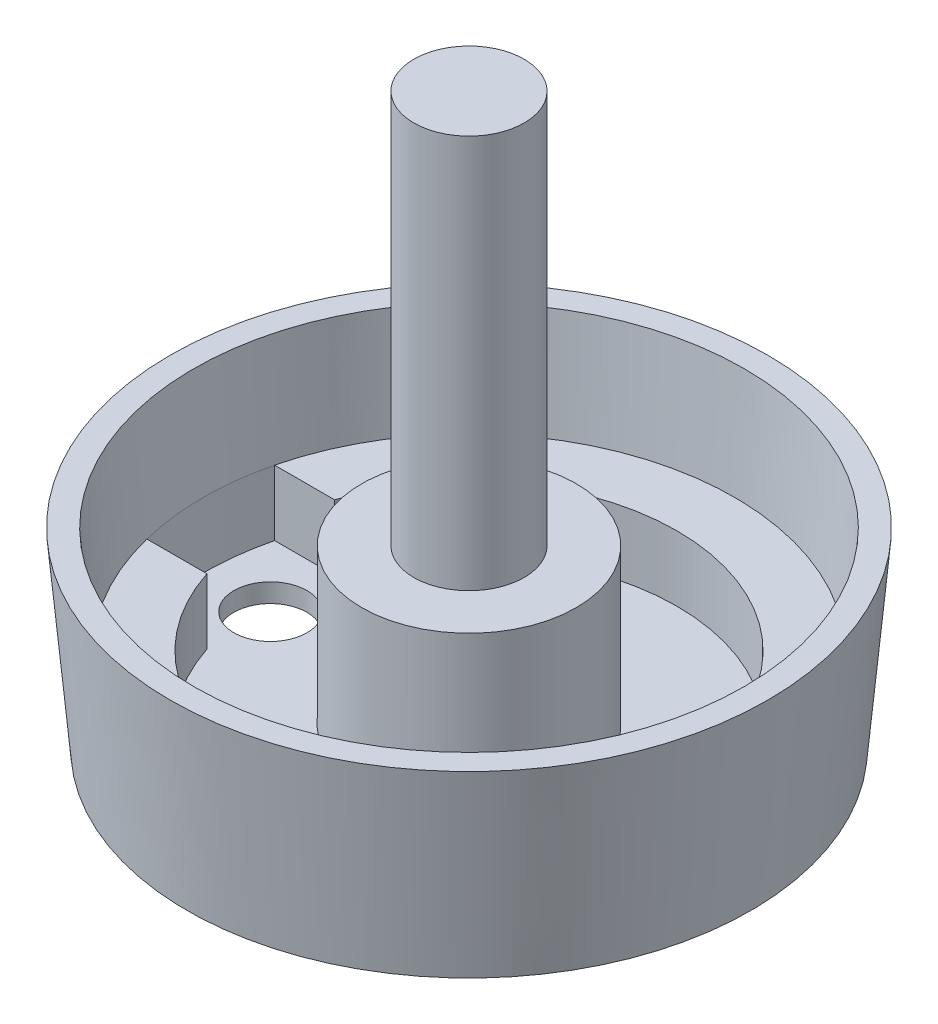
ISO-10303-21;
HEADER;
FILE_DESCRIPTION(('STEP AP214'),'2;1');
FILE_NAME('part.step','',(''),(''),'','','');
FILE_SCHEMA(('AUTOMOTIVE_DESIGN { 1 0 10303 214 1 1 1 1 }'));
ENDSEC;
DATA;
#1=APPLICATION_CONTEXT('core data for automotive mechanical design processes');
#2=APPLICATION_PROTOCOL_DEFINITION('international standard','automotive_design',2000,#1);
#3=PRODUCT_CONTEXT('',#1,'mechanical');
#4=PRODUCT('Part','Part','',(#3));
#5=PRODUCT_RELATED_PRODUCT_CATEGORY('part','',(#4));
#6=PRODUCT_DEFINITION_FORMATION('','',#4);
#7=PRODUCT_DEFINITION_CONTEXT('part definition',#1,'design');
#8=PRODUCT_DEFINITION('design','',#6,#7);
#9=PRODUCT_DEFINITION_SHAPE('','',#8);
#10=(LENGTH_UNIT() NAMED_UNIT(*) SI_UNIT(.MILLI.,.METRE.));
#11=(NAMED_UNIT(*) PLANE_ANGLE_UNIT() SI_UNIT($,.RADIAN.));
#12=(NAMED_UNIT(*) SI_UNIT($,.STERADIAN.) SOLID_ANGLE_UNIT());
#13=UNCERTAINTY_MEASURE_WITH_UNIT(LENGTH_MEASURE(1.E-05),#10,'distance_accuracy_value','');
#14=(GEOMETRIC_REPRESENTATION_CONTEXT(3) GLOBAL_UNCERTAINTY_ASSIGNED_CONTEXT((#13)) GLOBAL_UNIT_ASSIGNED_CONTEXT((#10,
#11,#12)) REPRESENTATION_CONTEXT('',''));
#15=CARTESIAN_POINT('',(0.,0.,0.));
#16=DIRECTION('',(0.,0.,1.));
#17=DIRECTION('',(1.,0.,0.));
#18=AXIS2_PLACEMENT_3D('',#15,#16,#17);
#19=CARTESIAN_POINT('',(16.891,31.242,0.));
#20=DIRECTION('',(0.,-1.,0.));
#21=DIRECTION('',(0.,0.,-1.));
#22=AXIS2_PLACEMENT_3D('',#19,#20,#21);
#23=CYLINDRICAL_SURFACE('',#22,3.175);
#24=CARTESIAN_POINT('',(16.891,0.,0.));
#25=DIRECTION('',(0.,-1.,0.));
#26=DIRECTION('',(0.,0.,-1.));
#27=AXIS2_PLACEMENT_3D('',#24,#25,#26);
#28=CIRCLE('',#27,3.175);
#29=CARTESIAN_POINT('',(16.891,0.,-3.175));
#30=VERTEX_POINT('',#29);
#31=EDGE_CURVE('E329',#30,#30,#28,.T.);
#32=CARTESIAN_POINT('',(16.891,1.56209999999999,0.));
#33=DIRECTION('',(0.,1.,0.));
#34=DIRECTION('',(0.,0.,1.));
#35=AXIS2_PLACEMENT_3D('',#32,#33,#34);
#36=CIRCLE('',#35,3.175);
#37=CARTESIAN_POINT('',(16.891,1.56209999999999,-3.175));
#38=VERTEX_POINT('',#37);
#39=EDGE_CURVE('E49',#38,#38,#36,.F.);
#40=CARTESIAN_POINT('',(16.891,0.,-3.175));
#41=CARTESIAN_POINT('',(16.891,0.0162718750000036,-3.175));
#42=CARTESIAN_POINT('',(16.891,0.0325437500000037,-3.175));
#43=CARTESIAN_POINT('',(16.891,0.0650875000000039,-3.175));
#44=CARTESIAN_POINT('',(16.891,0.081359375000004,-3.175));
#45=CARTESIAN_POINT('',(16.891,0.113903125000003,-3.175));
#46=CARTESIAN_POINT('',(16.891,0.130175000000002,-3.175));
#47=CARTESIAN_POINT('',(16.891,0.162718750000001,-3.175));
#48=CARTESIAN_POINT('',(16.891,0.178990625000001,-3.175));
#49=CARTESIAN_POINT('',(16.891,0.211534375000001,-3.175));
#50=CARTESIAN_POINT('',(16.891,0.227806250000002,-3.175));
#51=CARTESIAN_POINT('',(16.891,0.260350000000002,-3.175));
#52=CARTESIAN_POINT('',(16.891,0.276621875000002,-3.175));
#53=CARTESIAN_POINT('',(16.891,0.309165625000002,-3.175));
#54=CARTESIAN_POINT('',(16.891,0.325437500000002,-3.175));
#55=CARTESIAN_POINT('',(16.891,0.357981250000001,-3.175));
#56=CARTESIAN_POINT('',(16.891,0.374253125,-3.175));
#57=CARTESIAN_POINT('',(16.891,0.406796874999999,-3.175));
#58=CARTESIAN_POINT('',(16.891,0.423068749999999,-3.175));
#59=CARTESIAN_POINT('',(16.891,0.4556125,-3.175));
#60=CARTESIAN_POINT('',(16.891,0.471884375,-3.175));
#61=CARTESIAN_POINT('',(16.891,0.504428125,-3.175));
#62=CARTESIAN_POINT('',(16.891,0.5207,-3.175));
#63=CARTESIAN_POINT('',(16.891,0.55324375,-3.175));
#64=CARTESIAN_POINT('',(16.891,0.569515625,-3.175));
#65=CARTESIAN_POINT('',(16.891,0.602059375000001,-3.175));
#66=CARTESIAN_POINT('',(16.891,0.618331250000001,-3.175));
#67=CARTESIAN_POINT('',(16.891,0.650875,-3.175));
#68=CARTESIAN_POINT('',(16.891,0.667146874999999,-3.175));
#69=CARTESIAN_POINT('',(16.891,0.699690624999998,-3.175));
#70=CARTESIAN_POINT('',(16.891,0.715962499999998,-3.175));
#71=CARTESIAN_POINT('',(16.891,0.748506249999998,-3.175));
#72=CARTESIAN_POINT('',(16.891,0.764778124999998,-3.175));
#73=CARTESIAN_POINT('',(16.891,0.797321874999999,-3.175));
#74=CARTESIAN_POINT('',(16.891,0.813593749999999,-3.175));
#75=CARTESIAN_POINT('',(16.891,0.846137499999999,-3.175));
#76=CARTESIAN_POINT('',(16.891,0.862409374999999,-3.175));
#77=CARTESIAN_POINT('',(16.891,0.894953124999998,-3.175));
#78=CARTESIAN_POINT('',(16.891,0.911224999999997,-3.175));
#79=CARTESIAN_POINT('',(16.891,0.943768749999996,-3.175));
#80=CARTESIAN_POINT('',(16.891,0.960040624999996,-3.175));
#81=CARTESIAN_POINT('',(16.891,0.992584374999996,-3.175));
#82=CARTESIAN_POINT('',(16.891,1.00885625,-3.175));
#83=CARTESIAN_POINT('',(16.891,1.0414,-3.175));
#84=CARTESIAN_POINT('',(16.891,1.057671875,-3.175));
#85=CARTESIAN_POINT('',(16.891,1.090215625,-3.175));
#86=CARTESIAN_POINT('',(16.891,1.1064875,-3.175));
#87=CARTESIAN_POINT('',(16.891,1.13903125,-3.175));
#88=CARTESIAN_POINT('',(16.891,1.155303125,-3.175));
#89=CARTESIAN_POINT('',(16.891,1.187846875,-3.175));
#90=CARTESIAN_POINT('',(16.891,1.20411875,-3.175));
#91=CARTESIAN_POINT('',(16.891,1.23666249999999,-3.175));
#92=CARTESIAN_POINT('',(16.891,1.25293437499999,-3.175));
#93=CARTESIAN_POINT('',(16.891,1.28547812499999,-3.175));
#94=CARTESIAN_POINT('',(16.891,1.30175,-3.175));
#95=CARTESIAN_POINT('',(16.891,1.33429375,-3.175));
#96=CARTESIAN_POINT('',(16.891,1.350565625,-3.175));
#97=CARTESIAN_POINT('',(16.891,1.383109375,-3.175));
#98=CARTESIAN_POINT('',(16.891,1.39938125,-3.175));
#99=CARTESIAN_POINT('',(16.891,1.43192499999999,-3.175));
#100=CARTESIAN_POINT('',(16.891,1.44819687499999,-3.175));
#101=CARTESIAN_POINT('',(16.891,1.48074062499999,-3.175));
#102=CARTESIAN_POINT('',(16.891,1.49701249999999,-3.175));
#103=CARTESIAN_POINT('',(16.891,1.52955624999999,-3.175));
#104=CARTESIAN_POINT('',(16.891,1.54582812499999,-3.175));
#105=CARTESIAN_POINT('',(16.891,1.56209999999999,-3.175));
#106=B_SPLINE_CURVE_WITH_KNOTS('',3,(#40,#41,#42,#43,#44,#45,#46,#47,#48,#49,#50,#51,#52,#53,
#54,#55,#56,#57,#58,#59,#60,#61,#62,#63,#64,#65,#66,#67,#68,#69,#70,#71,#72,#73,#74,#75,#76,#77,
#78,#79,#80,#81,#82,#83,#84,#85,#86,#87,#88,#89,#90,#91,#92,#93,#94,#95,#96,#97,#98,#99,#100,
#101,#102,#103,#104,#105),.UNSPECIFIED.,.F.,.F.,(4,2,2,2,2,2,2,2,2,2,2,2,2,2,2,2,2,2,2,2,2,2,2,
2,2,2,2,2,2,2,2,2,4),(0.,0.0488156250000003,0.0976312500000007,0.146446874999998,
0.195262499999998,0.244078124999998,0.292893749999999,0.341709374999999,0.390524999999996,
0.439340624999996,0.488156249999996,0.536971874999997,0.585787499999997,0.634603124999997,
0.683418749999994,0.732234374999995,0.781049999999995,0.829865624999995,0.878681249999996,
0.927496874999992,0.976312499999993,1.02512812499999,1.07394374999999,1.12275937499999,
1.17157499999999,1.22039062499999,1.26920624999999,1.31802187499999,1.36683749999999,
1.41565312499999,1.46446874999999,1.51328437499999,1.56209999999999),.UNSPECIFIED.);
#107=EDGE_CURVE('BSEAM45',#30,#38,#106,.T.);
#108=ORIENTED_EDGE('',*,*,#31,.T.);
#109=ORIENTED_EDGE('',*,*,#39,.F.);
#110=ORIENTED_EDGE('',*,*,#107,.T.);
#111=ORIENTED_EDGE('',*,*,#107,.F.);
#112=EDGE_LOOP('',(#108,#110,#109,#111));
#113=FACE_BOUND('',#112,.T.);
#114=ADVANCED_FACE('F45',(#113),#23,.F.);
#115=CARTESIAN_POINT('',(0.,0.,0.));
#116=DIRECTION('',(0.,1.,0.));
#117=DIRECTION('',(0.,0.,1.));
#118=AXIS2_PLACEMENT_3D('',#115,#116,#117);
#119=PLANE('',#118);
#120=CARTESIAN_POINT('',(0.,0.,0.));
#121=DIRECTION('',(0.,-1.,0.));
#122=DIRECTION('',(0.,0.,-1.));
#123=AXIS2_PLACEMENT_3D('',#120,#121,#122);
#124=CIRCLE('',#123,46.101);
#125=CARTESIAN_POINT('',(0.,0.,-46.101));
#126=VERTEX_POINT('',#125);
#127=EDGE_CURVE('E349',#126,#126,#124,.T.);
#128=ORIENTED_EDGE('',*,*,#127,.T.);
#129=EDGE_LOOP('',(#128));
#130=FACE_BOUND('',#129,.T.);
#131=CARTESIAN_POINT('',(-32.4993,0.,0.));
#132=DIRECTION('',(0.,-1.,0.));
#133=DIRECTION('',(0.,0.,-1.));
#134=AXIS2_PLACEMENT_3D('',#131,#132,#133);
#135=CIRCLE('',#134,5.9817);
#136=CARTESIAN_POINT('',(-32.4993,0.,-5.9817));
#137=VERTEX_POINT('',#136);
#138=EDGE_CURVE('E328',#137,#137,#135,.T.);
#139=ORIENTED_EDGE('',*,*,#138,.F.);
#140=EDGE_LOOP('',(#139));
#141=FACE_BOUND('',#140,.T.);
#142=ORIENTED_EDGE('',*,*,#31,.F.);
#143=EDGE_LOOP('',(#142));
#144=FACE_BOUND('',#143,.T.);
#145=DIRECTION('',(0.,0.,1.));
#146=VECTOR('',#145,1.);
#147=CARTESIAN_POINT('',(9.652,0.,18.90395));
#148=LINE('',#147,#146);
#149=CARTESIAN_POINT('',(9.652,0.,-18.90395));
#150=VERTEX_POINT('',#149);
#151=CARTESIAN_POINT('',(9.652,0.,18.90395));
#152=VERTEX_POINT('',#151);
#153=EDGE_CURVE('E242',#150,#152,#148,.T.);
#154=ORIENTED_EDGE('',*,*,#153,.F.);
#155=DIRECTION('',(1.,0.,0.));
#156=VECTOR('',#155,1.);
#157=CARTESIAN_POINT('',(-9.652,0.,-18.90395));
#158=LINE('',#157,#156);
#159=CARTESIAN_POINT('',(-9.652,0.,-18.90395));
#160=VERTEX_POINT('',#159);
#161=EDGE_CURVE('E248',#160,#150,#158,.T.);
#162=ORIENTED_EDGE('',*,*,#161,.F.);
#163=DIRECTION('',(0.,0.,-1.));
#164=VECTOR('',#163,1.);
#165=CARTESIAN_POINT('',(-9.652,0.,18.90395));
#166=LINE('',#165,#164);
#167=CARTESIAN_POINT('',(-9.652,0.,18.90395));
#168=VERTEX_POINT('',#167);
#169=EDGE_CURVE('E263',#168,#160,#166,.T.);
#170=ORIENTED_EDGE('',*,*,#169,.F.);
#171=DIRECTION('',(-1.,0.,0.));
#172=VECTOR('',#171,1.);
#173=CARTESIAN_POINT('',(-9.652,0.,18.90395));
#174=LINE('',#173,#172);
#175=EDGE_CURVE('E69',#152,#168,#174,.T.);
#176=ORIENTED_EDGE('',*,*,#175,.F.);
#177=EDGE_LOOP('',(#154,#162,#170,#176));
#178=FACE_BOUND('',#177,.T.);
#179=ADVANCED_FACE('F47',(#130,#141,#144,#178),#119,.F.);
#180=CARTESIAN_POINT('',(-32.4993,31.242,0.));
#181=DIRECTION('',(0.,-1.,0.));
#182=DIRECTION('',(0.,0.,-1.));
#183=AXIS2_PLACEMENT_3D('',#180,#181,#182);
#184=CYLINDRICAL_SURFACE('',#183,5.9817);
#185=CARTESIAN_POINT('',(-32.4993,3.08609999999999,0.));
#186=DIRECTION('',(0.,1.,0.));
#187=DIRECTION('',(0.,0.,1.));
#188=AXIS2_PLACEMENT_3D('',#185,#186,#187);
#189=CIRCLE('',#188,5.9817);
#190=CARTESIAN_POINT('',(-32.4993,3.08609999999999,-5.9817));
#191=VERTEX_POINT('',#190);
#192=EDGE_CURVE('E315',#191,#191,#189,.F.);
#193=CARTESIAN_POINT('',(-32.4993,0.,-5.9817));
#194=CARTESIAN_POINT('',(-32.4993,0.0321468750000033,-5.9817));
#195=CARTESIAN_POINT('',(-32.4993,0.0642937500000031,-5.9817));
#196=CARTESIAN_POINT('',(-32.4993,0.128587500000003,-5.9817));
#197=CARTESIAN_POINT('',(-32.4993,0.160734375000002,-5.9817));
#198=CARTESIAN_POINT('',(-32.4993,0.225028125000002,-5.9817));
#199=CARTESIAN_POINT('',(-32.4993,0.257175000000002,-5.9817));
#200=CARTESIAN_POINT('',(-32.4993,0.321468750000001,-5.9817));
#201=CARTESIAN_POINT('',(-32.4993,0.353615625000001,-5.9817));
#202=CARTESIAN_POINT('',(-32.4993,0.417909375000001,-5.9817));
#203=CARTESIAN_POINT('',(-32.4993,0.450056250000001,-5.9817));
#204=CARTESIAN_POINT('',(-32.4993,0.51435,-5.9817));
#205=CARTESIAN_POINT('',(-32.4993,0.546496875,-5.9817));
#206=CARTESIAN_POINT('',(-32.4993,0.610790625,-5.9817));
#207=CARTESIAN_POINT('',(-32.4993,0.642937499999999,-5.9817));
#208=CARTESIAN_POINT('',(-32.4993,0.707231249999999,-5.9817));
#209=CARTESIAN_POINT('',(-32.4993,0.739378124999999,-5.9817));
#210=CARTESIAN_POINT('',(-32.4993,0.803671875,-5.9817));
#211=CARTESIAN_POINT('',(-32.4993,0.83581875,-5.9817));
#212=CARTESIAN_POINT('',(-32.4993,0.900112500000001,-5.9817));
#213=CARTESIAN_POINT('',(-32.4993,0.932259375000001,-5.9817));
#214=CARTESIAN_POINT('',(-32.4993,0.996553125000001,-5.9817));
#215=CARTESIAN_POINT('',(-32.4993,1.0287,-5.9817));
#216=CARTESIAN_POINT('',(-32.4993,1.09299375,-5.9817));
#217=CARTESIAN_POINT('',(-32.4993,1.125140625,-5.9817));
#218=CARTESIAN_POINT('',(-32.4993,1.189434375,-5.9817));
#219=CARTESIAN_POINT('',(-32.4993,1.22158125,-5.9817));
#220=CARTESIAN_POINT('',(-32.4993,1.285875,-5.9817));
#221=CARTESIAN_POINT('',(-32.4993,1.318021875,-5.9817));
#222=CARTESIAN_POINT('',(-32.4993,1.382315625,-5.9817));
#223=CARTESIAN_POINT('',(-32.4993,1.4144625,-5.9817));
#224=CARTESIAN_POINT('',(-32.4993,1.47875625,-5.9817));
#225=CARTESIAN_POINT('',(-32.4993,1.510903125,-5.9817));
#226=CARTESIAN_POINT('',(-32.4993,1.575196875,-5.9817));
#227=CARTESIAN_POINT('',(-32.4993,1.60734375,-5.9817));
#228=CARTESIAN_POINT('',(-32.4993,1.6716375,-5.9817));
#229=CARTESIAN_POINT('',(-32.4993,1.703784375,-5.9817));
#230=CARTESIAN_POINT('',(-32.4993,1.768078125,-5.9817));
#231=CARTESIAN_POINT('',(-32.4993,1.800225,-5.9817));
#232=CARTESIAN_POINT('',(-32.4993,1.86451875,-5.9817));
#233=CARTESIAN_POINT('',(-32.4993,1.89666562499999,-5.9817));
#234=CARTESIAN_POINT('',(-32.4993,1.96095937499999,-5.9817));
#235=CARTESIAN_POINT('',(-32.4993,1.99310624999999,-5.9817));
#236=CARTESIAN_POINT('',(-32.4993,2.05739999999999,-5.9817));
#237=CARTESIAN_POINT('',(-32.4993,2.08954687499999,-5.9817));
#238=CARTESIAN_POINT('',(-32.4993,2.15384062499999,-5.9817));
#239=CARTESIAN_POINT('',(-32.4993,2.1859875,-5.9817));
#240=CARTESIAN_POINT('',(-32.4993,2.25028125,-5.9817));
#241=CARTESIAN_POINT('',(-32.4993,2.282428125,-5.9817));
#242=CARTESIAN_POINT('',(-32.4993,2.346721875,-5.9817));
#243=CARTESIAN_POINT('',(-32.4993,2.37886875,-5.9817));
#244=CARTESIAN_POINT('',(-32.4993,2.44316249999999,-5.9817));
#245=CARTESIAN_POINT('',(-32.4993,2.47530937499999,-5.9817));
#246=CARTESIAN_POINT('',(-32.4993,2.53960312499999,-5.9817));
#247=CARTESIAN_POINT('',(-32.4993,2.57174999999999,-5.9817));
#248=CARTESIAN_POINT('',(-32.4993,2.63604374999999,-5.9817));
#249=CARTESIAN_POINT('',(-32.4993,2.66819062499999,-5.9817));
#250=CARTESIAN_POINT('',(-32.4993,2.73248437499999,-5.9817));
#251=CARTESIAN_POINT('',(-32.4993,2.76463124999999,-5.9817));
#252=CARTESIAN_POINT('',(-32.4993,2.82892499999999,-5.9817));
#253=CARTESIAN_POINT('',(-32.4993,2.86107187499999,-5.9817));
#254=CARTESIAN_POINT('',(-32.4993,2.92536562499999,-5.9817));
#255=CARTESIAN_POINT('',(-32.4993,2.95751249999999,-5.9817));
#256=CARTESIAN_POINT('',(-32.4993,3.02180624999999,-5.9817));
#257=CARTESIAN_POINT('',(-32.4993,3.05395312499999,-5.9817));
#258=CARTESIAN_POINT('',(-32.4993,3.08609999999999,-5.9817));
#259=B_SPLINE_CURVE_WITH_KNOTS('',3,(#193,#194,#195,#196,#197,#198,#199,#200,#201,#202,#203,
#204,#205,#206,#207,#208,#209,#210,#211,#212,#213,#214,#215,#216,#217,#218,#219,#220,#221,#222,
#223,#224,#225,#226,#227,#228,#229,#230,#231,#232,#233,#234,#235,#236,#237,#238,#239,#240,#241,
#242,#243,#244,#245,#246,#247,#248,#249,#250,#251,#252,#253,#254,#255,#256,#257,#258),
.UNSPECIFIED.,.F.,.F.,(4,2,2,2,2,2,2,2,2,2,2,2,2,2,2,2,2,2,2,2,2,2,2,2,2,2,2,2,2,2,2,2,4),(0.,
0.0964406249999994,0.192881249999999,0.289321874999998,0.385762499999998,0.482203124999997,
0.578643749999996,0.675084374999996,0.771524999999995,0.867965624999998,0.964406249999997,
1.060846875,1.1572875,1.253728125,1.35016875,1.44660937499999,1.54304999999999,1.63949062499999,
1.73593124999999,1.83237187499999,1.92881249999999,2.02525312499999,2.12169374999999,
2.21813437499999,2.31457499999999,2.41101562499999,2.50745624999999,2.60389687499999,
2.70033749999999,2.79677812499999,2.89321874999999,2.98965937499999,3.08609999999999),.UNSPECIFIED.);
#260=EDGE_CURVE('BSEAM388',#137,#191,#259,.T.);
#261=ORIENTED_EDGE('',*,*,#138,.T.);
#262=ORIENTED_EDGE('',*,*,#192,.F.);
#263=ORIENTED_EDGE('',*,*,#260,.T.);
#264=ORIENTED_EDGE('',*,*,#260,.F.);
#265=EDGE_LOOP('',(#261,#263,#262,#264));
#266=FACE_BOUND('',#265,.T.);
#267=ADVANCED_FACE('F388',(#266),#184,.F.);
#268=CARTESIAN_POINT('',(0.,31.242,0.));
#269=DIRECTION('',(0.,1.,0.));
#270=DIRECTION('',(0.,0.,1.));
#271=AXIS2_PLACEMENT_3D('',#268,#269,#270);
#272=CONICAL_SURFACE('',#271,48.895,0.0891936125917333);
#273=ORIENTED_EDGE('',*,*,#127,.F.);
#274=EDGE_LOOP('',(#273));
#275=FACE_BOUND('',#274,.T.);
#276=CARTESIAN_POINT('',(0.,31.242,0.));
#277=DIRECTION('',(0.,-1.,0.));
#278=DIRECTION('',(0.,0.,-1.));
#279=AXIS2_PLACEMENT_3D('',#276,#277,#278);
#280=CIRCLE('',#279,48.895);
#281=CARTESIAN_POINT('',(0.,31.242,-48.895));
#282=VERTEX_POINT('',#281);
#283=EDGE_CURVE('E345',#282,#282,#280,.T.);
#284=ORIENTED_EDGE('',*,*,#283,.T.);
#285=EDGE_LOOP('',(#284));
#286=FACE_BOUND('',#285,.T.);
#287=ADVANCED_FACE('F397',(#275,#286),#272,.T.);
#288=CARTESIAN_POINT('',(-48.895,31.242,0.));
#289=DIRECTION('',(0.,-1.,0.));
#290=DIRECTION('',(0.,0.,-1.));
#291=AXIS2_PLACEMENT_3D('',#288,#289,#290);
#292=PLANE('',#291);
#293=ORIENTED_EDGE('',*,*,#283,.F.);
#294=EDGE_LOOP('',(#293));
#295=FACE_BOUND('',#294,.T.);
#296=CARTESIAN_POINT('',(0.,31.242,0.));
#297=DIRECTION('',(0.,-1.,0.));
#298=DIRECTION('',(0.,0.,-1.));
#299=AXIS2_PLACEMENT_3D('',#296,#297,#298);
#300=CIRCLE('',#299,45.0572124);
#301=CARTESIAN_POINT('',(0.,31.242,-45.0572124));
#302=VERTEX_POINT('',#301);
#303=EDGE_CURVE('E341',#302,#302,#300,.T.);
#304=ORIENTED_EDGE('',*,*,#303,.T.);
#305=EDGE_LOOP('',(#304));
#306=FACE_BOUND('',#305,.T.);
#307=ADVANCED_FACE('F406',(#295,#306),#292,.F.);
#308=CARTESIAN_POINT('',(0.,13.7795,0.));
#309=DIRECTION('',(0.,1.,0.));
#310=DIRECTION('',(0.,0.,1.));
#311=AXIS2_PLACEMENT_3D('',#308,#309,#310);
#312=CONICAL_SURFACE('',#311,43.49552540813,0.0891936125917336);
#313=ORIENTED_EDGE('',*,*,#303,.F.);
#314=EDGE_LOOP('',(#313));
#315=FACE_BOUND('',#314,.T.);
#316=CARTESIAN_POINT('',(0.,13.7795,0.));
#317=DIRECTION('',(0.,-1.,0.));
#318=DIRECTION('',(0.,0.,-1.));
#319=AXIS2_PLACEMENT_3D('',#316,#317,#318);
#320=CIRCLE('',#319,43.49552540813);
#321=CARTESIAN_POINT('',(-42.2068287717377,13.7795,10.50925));
#322=VERTEX_POINT('',#321);
#323=CARTESIAN_POINT('',(-42.2304313798626,13.7795,-10.414));
#324=VERTEX_POINT('',#323);
#325=EDGE_CURVE('E337',#322,#324,#320,.T.);
#326=ORIENTED_EDGE('',*,*,#325,.T.);
#327=EDGE_CURVE('E333',#324,#322,#320,.T.);
#328=ORIENTED_EDGE('',*,*,#327,.T.);
#329=EDGE_LOOP('',(#326,#328));
#330=FACE_BOUND('',#329,.T.);
#331=ADVANCED_FACE('F402',(#315,#330),#312,.F.);
#332=CARTESIAN_POINT('',(-43.49552540813,13.7795,0.));
#333=DIRECTION('',(0.,-1.,0.));
#334=DIRECTION('',(0.,0.,-1.));
#335=AXIS2_PLACEMENT_3D('',#332,#333,#334);
#336=PLANE('',#335);
#337=CARTESIAN_POINT('',(0.,13.7795,0.));
#338=DIRECTION('',(0.,1.,0.));
#339=DIRECTION('',(0.,0.,1.));
#340=AXIS2_PLACEMENT_3D('',#337,#338,#339);
#341=CIRCLE('',#340,34.036);
#342=CARTESIAN_POINT('',(-32.3729047265997,13.7795,10.50925));
#343=VERTEX_POINT('',#342);
#344=CARTESIAN_POINT('',(-32.4036710883196,13.7795,-10.414));
#345=VERTEX_POINT('',#344);
#346=EDGE_CURVE('E284',#343,#345,#341,.T.);
#347=ORIENTED_EDGE('',*,*,#346,.F.);
#348=DIRECTION('',(1.,0.,0.));
#349=VECTOR('',#348,1.);
#350=CARTESIAN_POINT('',(-32.3729047265997,13.7795,10.50925));
#351=LINE('',#350,#349);
#352=EDGE_CURVE('E290',#322,#343,#351,.T.);
#353=ORIENTED_EDGE('',*,*,#352,.F.);
#354=ORIENTED_EDGE('',*,*,#327,.F.);
#355=DIRECTION('',(-1.,0.,0.));
#356=VECTOR('',#355,1.);
#357=CARTESIAN_POINT('',(-32.4036710883196,13.7795,-10.414));
#358=LINE('',#357,#356);
#359=EDGE_CURVE('E305',#345,#324,#358,.T.);
#360=ORIENTED_EDGE('',*,*,#359,.F.);
#361=EDGE_LOOP('',(#347,#353,#354,#360));
#362=FACE_BOUND('',#361,.T.);
#363=ADVANCED_FACE('F399',(#362),#336,.F.);
#364=CARTESIAN_POINT('',(0.,3.08609999999999,0.));
#365=DIRECTION('',(0.,1.,0.));
#366=DIRECTION('',(0.,0.,1.));
#367=AXIS2_PLACEMENT_3D('',#364,#365,#366);
#368=PLANE('',#367);
#369=DIRECTION('',(0.866025403784439,0.,0.5));
#370=VECTOR('',#369,1.);
#371=CARTESIAN_POINT('',(11.33475,3.08609999999999,3.20790243318486));
#372=LINE('',#371,#370);
#373=CARTESIAN_POINT('',(16.4483706135335,3.08609999999999,6.16025267094203));
#374=VERTEX_POINT('',#373);
#375=CARTESIAN_POINT('',(16.891,3.08609999999999,6.41580486636972));
#376=VERTEX_POINT('',#375);
#377=EDGE_CURVE('E188',#374,#376,#372,.T.);
#378=ORIENTED_EDGE('',*,*,#377,.F.);
#379=CARTESIAN_POINT('',(0.,3.08609999999999,0.));
#380=DIRECTION('',(0.,1.,0.));
#381=DIRECTION('',(0.,0.,1.));
#382=AXIS2_PLACEMENT_3D('',#379,#380,#381);
#383=CIRCLE('',#382,17.5641);
#384=CARTESIAN_POINT('',(16.4483706135335,3.08609999999999,-6.16025267094203));
#385=VERTEX_POINT('',#384);
#386=EDGE_CURVE('E352',#374,#385,#383,.F.);
#387=ORIENTED_EDGE('',*,*,#386,.T.);
#388=DIRECTION('',(-0.866025403784439,0.,0.5));
#389=VECTOR('',#388,1.);
#390=CARTESIAN_POINT('',(16.891,3.08609999999999,-6.41580486636972));
#391=LINE('',#390,#389);
#392=CARTESIAN_POINT('',(16.891,3.08609999999999,-6.41580486636972));
#393=VERTEX_POINT('',#392);
#394=EDGE_CURVE('E212',#393,#385,#391,.T.);
#395=ORIENTED_EDGE('',*,*,#394,.F.);
#396=DIRECTION('',(-0.866025403784439,0.,-0.5));
#397=VECTOR('',#396,1.);
#398=CARTESIAN_POINT('',(22.44725,3.08609999999999,-3.20790243318486));
#399=LINE('',#398,#397);
#400=CARTESIAN_POINT('',(22.44725,3.08609999999999,-3.20790243318486));
#401=VERTEX_POINT('',#400);
#402=EDGE_CURVE('E207',#401,#393,#399,.T.);
#403=ORIENTED_EDGE('',*,*,#402,.F.);
#404=DIRECTION('',(0.,0.,-1.));
#405=VECTOR('',#404,1.);
#406=CARTESIAN_POINT('',(22.44725,3.08609999999999,3.20790243318486));
#407=LINE('',#406,#405);
#408=CARTESIAN_POINT('',(22.44725,3.08609999999999,3.20790243318486));
#409=VERTEX_POINT('',#408);
#410=EDGE_CURVE('E204',#409,#401,#407,.T.);
#411=ORIENTED_EDGE('',*,*,#410,.F.);
#412=DIRECTION('',(0.866025403784438,0.,-0.5));
#413=VECTOR('',#412,1.);
#414=CARTESIAN_POINT('',(16.891,3.08609999999999,6.41580486636972));
#415=LINE('',#414,#413);
#416=EDGE_CURVE('E162',#376,#409,#415,.T.);
#417=ORIENTED_EDGE('',*,*,#416,.F.);
#418=EDGE_LOOP('',(#378,#387,#395,#403,#411,#417));
#419=FACE_BOUND('',#418,.T.);
#420=CARTESIAN_POINT('',(0.,3.08609999999999,0.));
#421=DIRECTION('',(0.,1.,0.));
#422=DIRECTION('',(0.,0.,1.));
#423=AXIS2_PLACEMENT_3D('',#420,#421,#422);
#424=CIRCLE('',#423,34.036);
#425=CARTESIAN_POINT('',(-32.3729047265997,3.08609999999999,10.50925));
#426=VERTEX_POINT('',#425);
#427=CARTESIAN_POINT('',(-32.4036710883196,3.08609999999999,-10.414));
#428=VERTEX_POINT('',#427);
#429=EDGE_CURVE('E285',#426,#428,#424,.T.);
#430=ORIENTED_EDGE('',*,*,#429,.T.);
#431=DIRECTION('',(-1.,0.,0.));
#432=VECTOR('',#431,1.);
#433=CARTESIAN_POINT('',(-32.4036710883196,3.08609999999999,-10.414));
#434=LINE('',#433,#432);
#435=CARTESIAN_POINT('',(-42.2304313798626,3.08609999999999,-10.414));
#436=VERTEX_POINT('',#435);
#437=EDGE_CURVE('E289',#428,#436,#434,.T.);
#438=ORIENTED_EDGE('',*,*,#437,.T.);
#439=CARTESIAN_POINT('',(0.,3.08609999999999,0.));
#440=DIRECTION('',(0.,1.,0.));
#441=DIRECTION('',(0.,0.,1.));
#442=AXIS2_PLACEMENT_3D('',#439,#440,#441);
#443=CIRCLE('',#442,43.49552540813);
#444=CARTESIAN_POINT('',(-42.2068287717377,3.08609999999999,10.50925));
#445=VERTEX_POINT('',#444);
#446=EDGE_CURVE('E294',#436,#445,#443,.T.);
#447=ORIENTED_EDGE('',*,*,#446,.T.);
#448=DIRECTION('',(1.,0.,0.));
#449=VECTOR('',#448,1.);
#450=CARTESIAN_POINT('',(-32.3729047265997,3.08609999999999,10.50925));
#451=LINE('',#450,#449);
#452=EDGE_CURVE('E298',#445,#426,#451,.T.);
#453=ORIENTED_EDGE('',*,*,#452,.T.);
#454=EDGE_LOOP('',(#430,#438,#447,#453));
#455=FACE_BOUND('',#454,.T.);
#456=ORIENTED_EDGE('',*,*,#192,.T.);
#457=EDGE_LOOP('',(#456));
#458=FACE_BOUND('',#457,.T.);
#459=ADVANCED_FACE('F362',(#419,#455,#458),#368,.T.);
#460=CARTESIAN_POINT('',(0.,3.08609999999999,0.));
#461=DIRECTION('',(0.,1.,0.));
#462=DIRECTION('',(0.,0.,1.));
#463=AXIS2_PLACEMENT_3D('',#460,#461,#462);
#464=CYLINDRICAL_SURFACE('',#463,34.036);
#465=ORIENTED_EDGE('',*,*,#346,.T.);
#466=DIRECTION('',(0.,1.,0.));
#467=VECTOR('',#466,1.);
#468=CARTESIAN_POINT('',(-32.4036710883196,3.08609999999999,-10.414));
#469=LINE('',#468,#467);
#470=EDGE_CURVE('E302',#428,#345,#469,.T.);
#471=ORIENTED_EDGE('',*,*,#470,.F.);
#472=ORIENTED_EDGE('',*,*,#429,.F.);
#473=DIRECTION('',(0.,1.,0.));
#474=VECTOR('',#473,1.);
#475=CARTESIAN_POINT('',(-32.3729047265997,3.08609999999999,10.50925));
#476=LINE('',#475,#474);
#477=EDGE_CURVE('E312',#426,#343,#476,.T.);
#478=ORIENTED_EDGE('',*,*,#477,.T.);
#479=EDGE_LOOP('',(#465,#471,#472,#478));
#480=FACE_BOUND('',#479,.T.);
#481=ADVANCED_FACE('F393',(#480),#464,.F.);
#482=CARTESIAN_POINT('',(-32.3729047265997,3.08609999999999,10.50925));
#483=DIRECTION('',(0.,0.,1.));
#484=DIRECTION('',(1.,0.,0.));
#485=AXIS2_PLACEMENT_3D('',#482,#483,#484);
#486=PLANE('',#485);
#487=ORIENTED_EDGE('',*,*,#352,.T.);
#488=ORIENTED_EDGE('',*,*,#477,.F.);
#489=ORIENTED_EDGE('',*,*,#452,.F.);
#490=DIRECTION('',(0.,1.,0.));
#491=VECTOR('',#490,1.);
#492=CARTESIAN_POINT('',(-42.2068287717377,3.08609999999999,10.50925));
#493=LINE('',#492,#491);
#494=EDGE_CURVE('E316',#445,#322,#493,.T.);
#495=ORIENTED_EDGE('',*,*,#494,.T.);
#496=EDGE_LOOP('',(#487,#488,#489,#495));
#497=FACE_BOUND('',#496,.T.);
#498=ADVANCED_FACE('F430',(#497),#486,.F.);
#499=CARTESIAN_POINT('',(0.,3.08609999999999,0.));
#500=DIRECTION('',(0.,1.,0.));
#501=DIRECTION('',(0.,0.,1.));
#502=AXIS2_PLACEMENT_3D('',#499,#500,#501);
#503=CYLINDRICAL_SURFACE('',#502,43.49552540813);
#504=ORIENTED_EDGE('',*,*,#325,.F.);
#505=ORIENTED_EDGE('',*,*,#494,.F.);
#506=ORIENTED_EDGE('',*,*,#446,.F.);
#507=DIRECTION('',(0.,1.,0.));
#508=VECTOR('',#507,1.);
#509=CARTESIAN_POINT('',(-42.2304313798626,3.08609999999999,-10.414));
#510=LINE('',#509,#508);
#511=EDGE_CURVE('E319',#436,#324,#510,.T.);
#512=ORIENTED_EDGE('',*,*,#511,.T.);
#513=EDGE_LOOP('',(#504,#505,#506,#512));
#514=FACE_BOUND('',#513,.T.);
#515=ADVANCED_FACE('F425',(#514),#503,.F.);
#516=CARTESIAN_POINT('',(-32.4036710883196,3.08609999999999,-10.414));
#517=DIRECTION('',(0.,0.,-1.));
#518=DIRECTION('',(-1.,0.,0.));
#519=AXIS2_PLACEMENT_3D('',#516,#517,#518);
#520=PLANE('',#519);
#521=ORIENTED_EDGE('',*,*,#359,.T.);
#522=ORIENTED_EDGE('',*,*,#511,.F.);
#523=ORIENTED_EDGE('',*,*,#437,.F.);
#524=ORIENTED_EDGE('',*,*,#470,.T.);
#525=EDGE_LOOP('',(#521,#522,#523,#524));
#526=FACE_BOUND('',#525,.T.);
#527=ADVANCED_FACE('F436',(#526),#520,.F.);
#528=CARTESIAN_POINT('',(9.652,-12.4587,18.90395));
#529=DIRECTION('',(-1.,0.,0.));
#530=DIRECTION('',(0.,0.,1.));
#531=AXIS2_PLACEMENT_3D('',#528,#529,#530);
#532=PLANE('',#531);
#533=ORIENTED_EDGE('',*,*,#153,.T.);
#534=DIRECTION('',(0.,1.,0.));
#535=VECTOR('',#534,1.);
#536=CARTESIAN_POINT('',(9.652,-12.4587,18.90395));
#537=LINE('',#536,#535);
#538=CARTESIAN_POINT('',(9.652,-12.4587,18.90395));
#539=VERTEX_POINT('',#538);
#540=EDGE_CURVE('E281',#539,#152,#537,.T.);
#541=ORIENTED_EDGE('',*,*,#540,.F.);
#542=DIRECTION('',(0.,0.,1.));
#543=VECTOR('',#542,1.);
#544=CARTESIAN_POINT('',(9.652,-12.4587,18.90395));
#545=LINE('',#544,#543);
#546=CARTESIAN_POINT('',(9.652,-12.4587,-18.90395));
#547=VERTEX_POINT('',#546);
#548=EDGE_CURVE('E243',#547,#539,#545,.T.);
#549=ORIENTED_EDGE('',*,*,#548,.F.);
#550=DIRECTION('',(0.,1.,0.));
#551=VECTOR('',#550,1.);
#552=CARTESIAN_POINT('',(9.652,-12.4587,-18.90395));
#553=LINE('',#552,#551);
#554=EDGE_CURVE('E257',#547,#150,#553,.T.);
#555=ORIENTED_EDGE('',*,*,#554,.T.);
#556=EDGE_LOOP('',(#533,#541,#549,#555));
#557=FACE_BOUND('',#556,.T.);
#558=ADVANCED_FACE('F448',(#557),#532,.F.);
#559=CARTESIAN_POINT('',(-9.652,-12.4587,18.90395));
#560=DIRECTION('',(0.,0.,-1.));
#561=DIRECTION('',(-1.,0.,0.));
#562=AXIS2_PLACEMENT_3D('',#559,#560,#561);
#563=PLANE('',#562);
#564=ORIENTED_EDGE('',*,*,#175,.T.);
#565=DIRECTION('',(0.,1.,0.));
#566=VECTOR('',#565,1.);
#567=CARTESIAN_POINT('',(-9.652,-12.4587,18.90395));
#568=LINE('',#567,#566);
#569=CARTESIAN_POINT('',(-9.652,-12.4587,18.90395));
#570=VERTEX_POINT('',#569);
#571=EDGE_CURVE('E277',#570,#168,#568,.T.);
#572=ORIENTED_EDGE('',*,*,#571,.F.);
#573=DIRECTION('',(-1.,0.,0.));
#574=VECTOR('',#573,1.);
#575=CARTESIAN_POINT('',(-9.652,-12.4587,18.90395));
#576=LINE('',#575,#574);
#577=EDGE_CURVE('E247',#539,#570,#576,.T.);
#578=ORIENTED_EDGE('',*,*,#577,.F.);
#579=ORIENTED_EDGE('',*,*,#540,.T.);
#580=EDGE_LOOP('',(#564,#572,#578,#579));
#581=FACE_BOUND('',#580,.T.);
#582=ADVANCED_FACE('F456',(#581),#563,.F.);
#583=CARTESIAN_POINT('',(-9.652,-12.4587,18.90395));
#584=DIRECTION('',(1.,0.,0.));
#585=DIRECTION('',(0.,0.,-1.));
#586=AXIS2_PLACEMENT_3D('',#583,#584,#585);
#587=PLANE('',#586);
#588=ORIENTED_EDGE('',*,*,#169,.T.);
#589=DIRECTION('',(0.,1.,0.));
#590=VECTOR('',#589,1.);
#591=CARTESIAN_POINT('',(-9.652,-12.4587,-18.90395));
#592=LINE('',#591,#590);
#593=CARTESIAN_POINT('',(-9.652,-12.4587,-18.90395));
#594=VERTEX_POINT('',#593);
#595=EDGE_CURVE('E273',#594,#160,#592,.T.);
#596=ORIENTED_EDGE('',*,*,#595,.F.);
#597=DIRECTION('',(0.,0.,-1.));
#598=VECTOR('',#597,1.);
#599=CARTESIAN_POINT('',(-9.652,-12.4587,18.90395));
#600=LINE('',#599,#598);
#601=EDGE_CURVE('E251',#570,#594,#600,.T.);
#602=ORIENTED_EDGE('',*,*,#601,.F.);
#603=ORIENTED_EDGE('',*,*,#571,.T.);
#604=EDGE_LOOP('',(#588,#596,#602,#603));
#605=FACE_BOUND('',#604,.T.);
#606=ADVANCED_FACE('F461',(#605),#587,.F.);
#607=CARTESIAN_POINT('',(-9.652,-12.4587,-18.90395));
#608=DIRECTION('',(0.,0.,1.));
#609=DIRECTION('',(1.,0.,0.));
#610=AXIS2_PLACEMENT_3D('',#607,#608,#609);
#611=PLANE('',#610);
#612=ORIENTED_EDGE('',*,*,#161,.T.);
#613=ORIENTED_EDGE('',*,*,#554,.F.);
#614=DIRECTION('',(1.,0.,0.));
#615=VECTOR('',#614,1.);
#616=CARTESIAN_POINT('',(-9.652,-12.4587,-18.90395));
#617=LINE('',#616,#615);
#618=EDGE_CURVE('E254',#594,#547,#617,.T.);
#619=ORIENTED_EDGE('',*,*,#618,.F.);
#620=ORIENTED_EDGE('',*,*,#595,.T.);
#621=EDGE_LOOP('',(#612,#613,#619,#620));
#622=FACE_BOUND('',#621,.T.);
#623=ADVANCED_FACE('F467',(#622),#611,.F.);
#624=CARTESIAN_POINT('',(0.,-12.4587,0.));
#625=DIRECTION('',(0.,-1.,0.));
#626=DIRECTION('',(0.,0.,-1.));
#627=AXIS2_PLACEMENT_3D('',#624,#625,#626);
#628=PLANE('',#627);
#629=ORIENTED_EDGE('',*,*,#548,.T.);
#630=ORIENTED_EDGE('',*,*,#577,.T.);
#631=ORIENTED_EDGE('',*,*,#601,.T.);
#632=ORIENTED_EDGE('',*,*,#618,.T.);
#633=EDGE_LOOP('',(#629,#630,#631,#632));
#634=FACE_BOUND('',#633,.T.);
#635=ADVANCED_FACE('F378',(#634),#628,.T.);
#636=CARTESIAN_POINT('',(0.,3.08609999999999,0.));
#637=DIRECTION('',(0.,1.,0.));
#638=DIRECTION('',(0.,0.,1.));
#639=AXIS2_PLACEMENT_3D('',#636,#637,#638);
#640=PLANE('',#639);
#641=CARTESIAN_POINT('',(11.33475,3.08609999999999,-3.20790243318486));
#642=VERTEX_POINT('',#641);
#643=EDGE_CURVE('E211',#385,#642,#391,.T.);
#644=ORIENTED_EDGE('',*,*,#643,.F.);
#645=EDGE_CURVE('E55',#385,#374,#383,.F.);
#646=ORIENTED_EDGE('',*,*,#645,.T.);
#647=CARTESIAN_POINT('',(11.33475,3.08609999999999,3.20790243318486));
#648=VERTEX_POINT('',#647);
#649=EDGE_CURVE('E184',#648,#374,#372,.T.);
#650=ORIENTED_EDGE('',*,*,#649,.F.);
#651=DIRECTION('',(0.,0.,1.));
#652=VECTOR('',#651,1.);
#653=CARTESIAN_POINT('',(11.33475,3.08609999999999,-3.20790243318486));
#654=LINE('',#653,#652);
#655=EDGE_CURVE('E215',#642,#648,#654,.T.);
#656=ORIENTED_EDGE('',*,*,#655,.F.);
#657=EDGE_LOOP('',(#644,#646,#650,#656));
#658=FACE_BOUND('',#657,.T.);
#659=ADVANCED_FACE('F368',(#658),#640,.F.);
#660=CARTESIAN_POINT('',(0.,28.6893,0.));
#661=DIRECTION('',(0.,-1.,0.));
#662=DIRECTION('',(0.,0.,-1.));
#663=AXIS2_PLACEMENT_3D('',#660,#661,#662);
#664=CYLINDRICAL_SURFACE('',#663,17.5641);
#665=CARTESIAN_POINT('',(0.,28.6893,0.));
#666=DIRECTION('',(0.,1.,0.));
#667=DIRECTION('',(0.,0.,1.));
#668=AXIS2_PLACEMENT_3D('',#665,#666,#667);
#669=CIRCLE('',#668,17.5641);
#670=CARTESIAN_POINT('',(0.,28.6893,17.5641));
#671=VERTEX_POINT('',#670);
#672=EDGE_CURVE('E237',#671,#671,#669,.T.);
#673=ORIENTED_EDGE('',*,*,#672,.F.);
#674=EDGE_LOOP('',(#673));
#675=FACE_BOUND('',#674,.T.);
#676=ORIENTED_EDGE('',*,*,#645,.F.);
#677=ORIENTED_EDGE('',*,*,#386,.F.);
#678=EDGE_LOOP('',(#676,#677));
#679=FACE_BOUND('',#678,.T.);
#680=ADVANCED_FACE('F365',(#675,#679),#664,.T.);
#681=CARTESIAN_POINT('',(0.,28.6893,0.));
#682=DIRECTION('',(0.,1.,0.));
#683=DIRECTION('',(0.,0.,1.));
#684=AXIS2_PLACEMENT_3D('',#681,#682,#683);
#685=PLANE('',#684);
#686=CARTESIAN_POINT('',(0.,28.6893,0.));
#687=DIRECTION('',(0.,1.,0.));
#688=DIRECTION('',(0.,0.,1.));
#689=AXIS2_PLACEMENT_3D('',#686,#687,#688);
#690=CIRCLE('',#689,9.03605);
#691=CARTESIAN_POINT('',(0.,28.6893,9.03605));
#692=VERTEX_POINT('',#691);
#693=EDGE_CURVE('E11',#692,#692,#690,.T.);
#694=ORIENTED_EDGE('',*,*,#693,.F.);
#695=EDGE_LOOP('',(#694));
#696=FACE_BOUND('',#695,.T.);
#697=ORIENTED_EDGE('',*,*,#672,.T.);
#698=EDGE_LOOP('',(#697));
#699=FACE_BOUND('',#698,.T.);
#700=ADVANCED_FACE('F367',(#696,#699),#685,.T.);
#701=CARTESIAN_POINT('',(0.,93.1164,0.));
#702=DIRECTION('',(0.,-1.,0.));
#703=DIRECTION('',(0.,0.,-1.));
#704=AXIS2_PLACEMENT_3D('',#701,#702,#703);
#705=CYLINDRICAL_SURFACE('',#704,9.03605);
#706=CARTESIAN_POINT('',(0.,93.1164,0.));
#707=DIRECTION('',(0.,1.,0.));
#708=DIRECTION('',(0.,0.,1.));
#709=AXIS2_PLACEMENT_3D('',#706,#707,#708);
#710=CIRCLE('',#709,9.03605);
#711=CARTESIAN_POINT('',(0.,93.1164,9.03605));
#712=VERTEX_POINT('',#711);
#713=EDGE_CURVE('E234',#712,#712,#710,.T.);
#714=ORIENTED_EDGE('',*,*,#713,.F.);
#715=EDGE_LOOP('',(#714));
#716=FACE_BOUND('',#715,.T.);
#717=ORIENTED_EDGE('',*,*,#693,.T.);
#718=EDGE_LOOP('',(#717));
#719=FACE_BOUND('',#718,.T.);
#720=ADVANCED_FACE('F375',(#716,#719),#705,.T.);
#721=CARTESIAN_POINT('',(0.,93.1164,0.));
#722=DIRECTION('',(0.,1.,0.));
#723=DIRECTION('',(0.,0.,1.));
#724=AXIS2_PLACEMENT_3D('',#721,#722,#723);
#725=PLANE('',#724);
#726=ORIENTED_EDGE('',*,*,#713,.T.);
#727=EDGE_LOOP('',(#726));
#728=FACE_BOUND('',#727,.T.);
#729=ADVANCED_FACE('F513',(#728),#725,.T.);
#730=CARTESIAN_POINT('',(0.,1.56209999999999,0.));
#731=DIRECTION('',(0.,1.,0.));
#732=DIRECTION('',(0.,0.,1.));
#733=AXIS2_PLACEMENT_3D('',#730,#731,#732);
#734=PLANE('',#733);
#735=DIRECTION('',(0.866025403784438,0.,-0.5));
#736=VECTOR('',#735,1.);
#737=CARTESIAN_POINT('',(16.891,1.56209999999999,6.41580486636972));
#738=LINE('',#737,#736);
#739=CARTESIAN_POINT('',(16.891,1.56209999999999,6.41580486636972));
#740=VERTEX_POINT('',#739);
#741=CARTESIAN_POINT('',(22.44725,1.56209999999999,3.20790243318486));
#742=VERTEX_POINT('',#741);
#743=EDGE_CURVE('E159',#740,#742,#738,.T.);
#744=ORIENTED_EDGE('',*,*,#743,.T.);
#745=DIRECTION('',(0.,0.,-1.));
#746=VECTOR('',#745,1.);
#747=CARTESIAN_POINT('',(22.44725,1.56209999999999,3.20790243318486));
#748=LINE('',#747,#746);
#749=CARTESIAN_POINT('',(22.44725,1.56209999999999,-3.20790243318486));
#750=VERTEX_POINT('',#749);
#751=EDGE_CURVE('E171',#742,#750,#748,.T.);
#752=ORIENTED_EDGE('',*,*,#751,.T.);
#753=DIRECTION('',(-0.866025403784439,0.,-0.5));
#754=VECTOR('',#753,1.);
#755=CARTESIAN_POINT('',(22.44725,1.56209999999999,-3.20790243318486));
#756=LINE('',#755,#754);
#757=CARTESIAN_POINT('',(16.891,1.56209999999999,-6.41580486636972));
#758=VERTEX_POINT('',#757);
#759=EDGE_CURVE('E177',#750,#758,#756,.T.);
#760=ORIENTED_EDGE('',*,*,#759,.T.);
#761=DIRECTION('',(-0.866025403784439,0.,0.5));
#762=VECTOR('',#761,1.);
#763=CARTESIAN_POINT('',(16.891,1.56209999999999,-6.41580486636972));
#764=LINE('',#763,#762);
#765=CARTESIAN_POINT('',(11.33475,1.56209999999999,-3.20790243318486));
#766=VERTEX_POINT('',#765);
#767=EDGE_CURVE('E193',#758,#766,#764,.T.);
#768=ORIENTED_EDGE('',*,*,#767,.T.);
#769=DIRECTION('',(0.,0.,1.));
#770=VECTOR('',#769,1.);
#771=CARTESIAN_POINT('',(11.33475,1.56209999999999,-3.20790243318486));
#772=LINE('',#771,#770);
#773=CARTESIAN_POINT('',(11.33475,1.56209999999999,3.20790243318486));
#774=VERTEX_POINT('',#773);
#775=EDGE_CURVE('E197',#766,#774,#772,.T.);
#776=ORIENTED_EDGE('',*,*,#775,.T.);
#777=DIRECTION('',(0.866025403784439,0.,0.5));
#778=VECTOR('',#777,1.);
#779=CARTESIAN_POINT('',(11.33475,1.56209999999999,3.20790243318486));
#780=LINE('',#779,#778);
#781=EDGE_CURVE('E168',#774,#740,#780,.T.);
#782=ORIENTED_EDGE('',*,*,#781,.T.);
#783=EDGE_LOOP('',(#744,#752,#760,#768,#776,#782));
#784=FACE_BOUND('',#783,.T.);
#785=ORIENTED_EDGE('',*,*,#39,.T.);
#786=EDGE_LOOP('',(#785));
#787=FACE_BOUND('',#786,.T.);
#788=ADVANCED_FACE('F179',(#784,#787),#734,.T.);
#789=CARTESIAN_POINT('',(16.891,1.56209999999999,6.41580486636972));
#790=DIRECTION('',(0.5,0.,0.866025403784438));
#791=DIRECTION('',(0.866025403784439,0.,-0.5));
#792=AXIS2_PLACEMENT_3D('',#789,#790,#791);
#793=PLANE('',#792);
#794=ORIENTED_EDGE('',*,*,#416,.T.);
#795=DIRECTION('',(0.,1.,0.));
#796=VECTOR('',#795,1.);
#797=CARTESIAN_POINT('',(22.44725,1.56209999999999,3.20790243318486));
#798=LINE('',#797,#796);
#799=EDGE_CURVE('E154',#742,#409,#798,.T.);
#800=ORIENTED_EDGE('',*,*,#799,.F.);
#801=ORIENTED_EDGE('',*,*,#743,.F.);
#802=DIRECTION('',(0.,1.,0.));
#803=VECTOR('',#802,1.);
#804=CARTESIAN_POINT('',(16.891,1.56209999999999,6.41580486636972));
#805=LINE('',#804,#803);
#806=EDGE_CURVE('E219',#740,#376,#805,.T.);
#807=ORIENTED_EDGE('',*,*,#806,.T.);
#808=EDGE_LOOP('',(#794,#800,#801,#807));
#809=FACE_BOUND('',#808,.T.);
#810=ADVANCED_FACE('F156',(#809),#793,.F.);
#811=CARTESIAN_POINT('',(11.33475,1.56209999999999,3.20790243318486));
#812=DIRECTION('',(-0.5,0.,0.866025403784439));
#813=DIRECTION('',(0.866025403784439,0.,0.5));
#814=AXIS2_PLACEMENT_3D('',#811,#812,#813);
#815=PLANE('',#814);
#816=ORIENTED_EDGE('',*,*,#649,.T.);
#817=ORIENTED_EDGE('',*,*,#377,.T.);
#818=ORIENTED_EDGE('',*,*,#806,.F.);
#819=ORIENTED_EDGE('',*,*,#781,.F.);
#820=DIRECTION('',(0.,1.,0.));
#821=VECTOR('',#820,1.);
#822=CARTESIAN_POINT('',(11.33475,1.56209999999999,3.20790243318486));
#823=LINE('',#822,#821);
#824=EDGE_CURVE('E222',#774,#648,#823,.T.);
#825=ORIENTED_EDGE('',*,*,#824,.T.);
#826=EDGE_LOOP('',(#816,#817,#818,#819,#825));
#827=FACE_BOUND('',#826,.T.);
#828=ADVANCED_FACE('F565',(#827),#815,.F.);
#829=CARTESIAN_POINT('',(11.33475,1.56209999999999,-3.20790243318486));
#830=DIRECTION('',(-1.,0.,0.));
#831=DIRECTION('',(0.,0.,1.));
#832=AXIS2_PLACEMENT_3D('',#829,#830,#831);
#833=PLANE('',#832);
#834=ORIENTED_EDGE('',*,*,#655,.T.);
#835=ORIENTED_EDGE('',*,*,#824,.F.);
#836=ORIENTED_EDGE('',*,*,#775,.F.);
#837=DIRECTION('',(0.,1.,0.));
#838=VECTOR('',#837,1.);
#839=CARTESIAN_POINT('',(11.33475,1.56209999999999,-3.20790243318486));
#840=LINE('',#839,#838);
#841=EDGE_CURVE('E225',#766,#642,#840,.T.);
#842=ORIENTED_EDGE('',*,*,#841,.T.);
#843=EDGE_LOOP('',(#834,#835,#836,#842));
#844=FACE_BOUND('',#843,.T.);
#845=ADVANCED_FACE('F575',(#844),#833,.F.);
#846=CARTESIAN_POINT('',(16.891,1.56209999999999,-6.41580486636972));
#847=DIRECTION('',(-0.5,0.,-0.866025403784439));
#848=DIRECTION('',(-0.866025403784439,0.,0.5));
#849=AXIS2_PLACEMENT_3D('',#846,#847,#848);
#850=PLANE('',#849);
#851=ORIENTED_EDGE('',*,*,#394,.T.);
#852=ORIENTED_EDGE('',*,*,#643,.T.);
#853=ORIENTED_EDGE('',*,*,#841,.F.);
#854=ORIENTED_EDGE('',*,*,#767,.F.);
#855=DIRECTION('',(0.,1.,0.));
#856=VECTOR('',#855,1.);
#857=CARTESIAN_POINT('',(16.891,1.56209999999999,-6.41580486636972));
#858=LINE('',#857,#856);
#859=EDGE_CURVE('E229',#758,#393,#858,.T.);
#860=ORIENTED_EDGE('',*,*,#859,.T.);
#861=EDGE_LOOP('',(#851,#852,#853,#854,#860));
#862=FACE_BOUND('',#861,.T.);
#863=ADVANCED_FACE('F586',(#862),#850,.F.);
#864=CARTESIAN_POINT('',(22.44725,1.56209999999999,-3.20790243318486));
#865=DIRECTION('',(0.5,0.,-0.866025403784439));
#866=DIRECTION('',(-0.866025403784439,0.,-0.5));
#867=AXIS2_PLACEMENT_3D('',#864,#865,#866);
#868=PLANE('',#867);
#869=ORIENTED_EDGE('',*,*,#402,.T.);
#870=ORIENTED_EDGE('',*,*,#859,.F.);
#871=ORIENTED_EDGE('',*,*,#759,.F.);
#872=DIRECTION('',(0.,1.,0.));
#873=VECTOR('',#872,1.);
#874=CARTESIAN_POINT('',(22.44725,1.56209999999999,-3.20790243318486));
#875=LINE('',#874,#873);
#876=EDGE_CURVE('E167',#750,#401,#875,.T.);
#877=ORIENTED_EDGE('',*,*,#876,.T.);
#878=EDGE_LOOP('',(#869,#870,#871,#877));
#879=FACE_BOUND('',#878,.T.);
#880=ADVANCED_FACE('F597',(#879),#868,.F.);
#881=CARTESIAN_POINT('',(22.44725,1.56209999999999,3.20790243318486));
#882=DIRECTION('',(1.,0.,0.));
#883=DIRECTION('',(0.,0.,-1.));
#884=AXIS2_PLACEMENT_3D('',#881,#882,#883);
#885=PLANE('',#884);
#886=ORIENTED_EDGE('',*,*,#410,.T.);
#887=ORIENTED_EDGE('',*,*,#876,.F.);
#888=ORIENTED_EDGE('',*,*,#751,.F.);
#889=ORIENTED_EDGE('',*,*,#799,.T.);
#890=EDGE_LOOP('',(#886,#887,#888,#889));
#891=FACE_BOUND('',#890,.T.);
#892=ADVANCED_FACE('F172',(#891),#885,.F.);
#893=CLOSED_SHELL('',(#114,#179,#267,#287,#307,#331,#363,#459,#481,#498,#515,#527,#558,#582,
#606,#623,#635,#659,#680,#700,#720,#729,#788,#810,#828,#845,#863,#880,#892));
#894=MANIFOLD_SOLID_BREP('B2',#893);
#895=ADVANCED_BREP_SHAPE_REPRESENTATION('',(#18,#894),#14);
#896=SHAPE_DEFINITION_REPRESENTATION(#9,#895);
ENDSEC;
END-ISO-10303-21;
